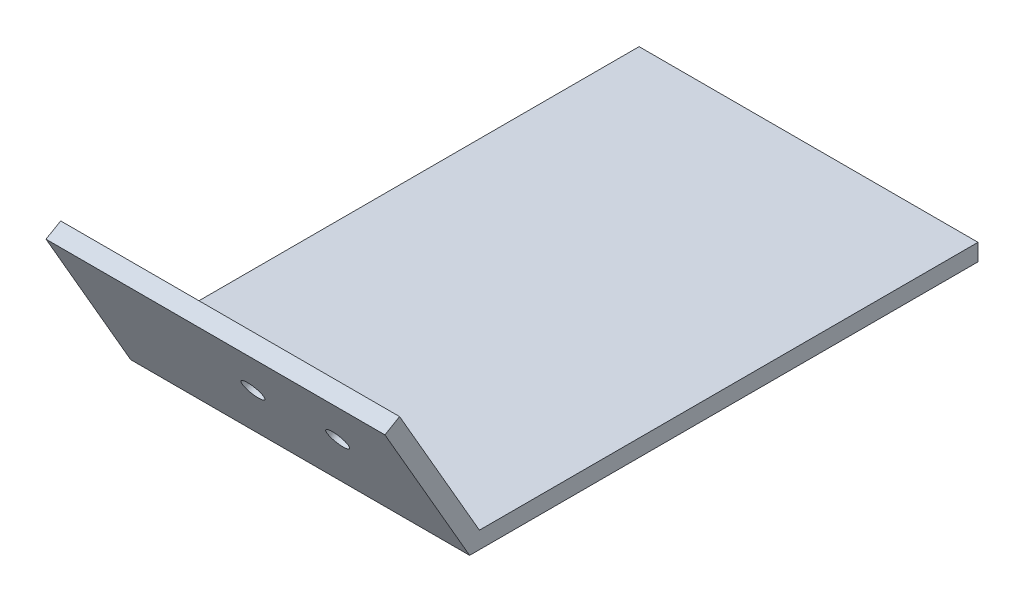
ISO-10303-21;
HEADER;
FILE_DESCRIPTION(('STEP AP214'),'2;1');
FILE_NAME('part.step','',(''),(''),'','','');
FILE_SCHEMA(('AUTOMOTIVE_DESIGN { 1 0 10303 214 1 1 1 1 }'));
ENDSEC;
DATA;
#1=APPLICATION_CONTEXT('core data for automotive mechanical design processes');
#2=APPLICATION_PROTOCOL_DEFINITION('international standard','automotive_design',2000,#1);
#3=PRODUCT_CONTEXT('',#1,'mechanical');
#4=PRODUCT('Part','Part','',(#3));
#5=PRODUCT_RELATED_PRODUCT_CATEGORY('part','',(#4));
#6=PRODUCT_DEFINITION_FORMATION('','',#4);
#7=PRODUCT_DEFINITION_CONTEXT('part definition',#1,'design');
#8=PRODUCT_DEFINITION('design','',#6,#7);
#9=PRODUCT_DEFINITION_SHAPE('','',#8);
#10=(LENGTH_UNIT() NAMED_UNIT(*) SI_UNIT(.MILLI.,.METRE.));
#11=(NAMED_UNIT(*) PLANE_ANGLE_UNIT() SI_UNIT($,.RADIAN.));
#12=(NAMED_UNIT(*) SI_UNIT($,.STERADIAN.) SOLID_ANGLE_UNIT());
#13=UNCERTAINTY_MEASURE_WITH_UNIT(LENGTH_MEASURE(1.E-05),#10,'distance_accuracy_value','');
#14=(GEOMETRIC_REPRESENTATION_CONTEXT(3) GLOBAL_UNCERTAINTY_ASSIGNED_CONTEXT((#13)) GLOBAL_UNIT_ASSIGNED_CONTEXT((#10,
#11,#12)) REPRESENTATION_CONTEXT('',''));
#15=CARTESIAN_POINT('',(0.,0.,0.));
#16=DIRECTION('',(0.,0.,1.));
#17=DIRECTION('',(1.,0.,0.));
#18=AXIS2_PLACEMENT_3D('',#15,#16,#17);
#19=CARTESIAN_POINT('',(100.,0.,-150.));
#20=DIRECTION('',(0.,1.,0.));
#21=DIRECTION('',(0.,0.,1.));
#22=AXIS2_PLACEMENT_3D('',#19,#20,#21);
#23=PLANE('',#22);
#24=DIRECTION('',(0.,0.,-1.));
#25=VECTOR('',#24,1.);
#26=CARTESIAN_POINT('',(0.,0.,-150.));
#27=LINE('',#26,#25);
#28=CARTESIAN_POINT('',(0.,0.,0.));
#29=VERTEX_POINT('',#28);
#30=CARTESIAN_POINT('',(0.,0.,-150.));
#31=VERTEX_POINT('',#30);
#32=EDGE_CURVE('E119',#29,#31,#27,.T.);
#33=ORIENTED_EDGE('',*,*,#32,.T.);
#34=DIRECTION('',(-1.,0.,0.));
#35=VECTOR('',#34,1.);
#36=CARTESIAN_POINT('',(100.,0.,-150.));
#37=LINE('',#36,#35);
#38=CARTESIAN_POINT('',(100.,0.,-150.));
#39=VERTEX_POINT('',#38);
#40=EDGE_CURVE('E11',#39,#31,#37,.T.);
#41=ORIENTED_EDGE('',*,*,#40,.F.);
#42=DIRECTION('',(0.,0.,-1.));
#43=VECTOR('',#42,1.);
#44=CARTESIAN_POINT('',(100.,0.,-150.));
#45=LINE('',#44,#43);
#46=CARTESIAN_POINT('',(100.,0.,0.));
#47=VERTEX_POINT('',#46);
#48=EDGE_CURVE('E130',#47,#39,#45,.T.);
#49=ORIENTED_EDGE('',*,*,#48,.F.);
#50=DIRECTION('',(-1.,0.,0.));
#51=VECTOR('',#50,1.);
#52=CARTESIAN_POINT('',(100.,0.,0.));
#53=LINE('',#52,#51);
#54=EDGE_CURVE('E115',#47,#29,#53,.T.);
#55=ORIENTED_EDGE('',*,*,#54,.T.);
#56=EDGE_LOOP('',(#33,#41,#49,#55));
#57=FACE_BOUND('',#56,.T.);
#58=ADVANCED_FACE('F33',(#57),#23,.F.);
#59=CARTESIAN_POINT('',(100.,5.00000000000001,-150.));
#60=DIRECTION('',(0.,0.,1.));
#61=DIRECTION('',(1.,0.,0.));
#62=AXIS2_PLACEMENT_3D('',#59,#60,#61);
#63=PLANE('',#62);
#64=DIRECTION('',(0.,1.,0.));
#65=VECTOR('',#64,1.);
#66=CARTESIAN_POINT('',(0.,5.00000000000001,-150.));
#67=LINE('',#66,#65);
#68=CARTESIAN_POINT('',(0.,5.00000000000001,-150.));
#69=VERTEX_POINT('',#68);
#70=EDGE_CURVE('E122',#31,#69,#67,.T.);
#71=ORIENTED_EDGE('',*,*,#70,.T.);
#72=DIRECTION('',(-1.,0.,0.));
#73=VECTOR('',#72,1.);
#74=CARTESIAN_POINT('',(100.,5.00000000000001,-150.));
#75=LINE('',#74,#73);
#76=CARTESIAN_POINT('',(100.,5.00000000000001,-150.));
#77=VERTEX_POINT('',#76);
#78=EDGE_CURVE('E42',#77,#69,#75,.T.);
#79=ORIENTED_EDGE('',*,*,#78,.F.);
#80=DIRECTION('',(0.,1.,0.));
#81=VECTOR('',#80,1.);
#82=CARTESIAN_POINT('',(100.,5.00000000000001,-150.));
#83=LINE('',#82,#81);
#84=EDGE_CURVE('E88',#39,#77,#83,.T.);
#85=ORIENTED_EDGE('',*,*,#84,.F.);
#86=ORIENTED_EDGE('',*,*,#40,.T.);
#87=EDGE_LOOP('',(#71,#79,#85,#86));
#88=FACE_BOUND('',#87,.T.);
#89=ADVANCED_FACE('F150',(#88),#63,.F.);
#90=CARTESIAN_POINT('',(100.,5.,-2.88675134594811));
#91=DIRECTION('',(0.,-1.,0.));
#92=DIRECTION('',(0.,0.,-1.));
#93=AXIS2_PLACEMENT_3D('',#90,#91,#92);
#94=PLANE('',#93);
#95=DIRECTION('',(0.,0.,1.));
#96=VECTOR('',#95,1.);
#97=CARTESIAN_POINT('',(0.,5.,-2.88675134594811));
#98=LINE('',#97,#96);
#99=CARTESIAN_POINT('',(0.,5.,-2.88675134594811));
#100=VERTEX_POINT('',#99);
#101=EDGE_CURVE('E125',#69,#100,#98,.T.);
#102=ORIENTED_EDGE('',*,*,#101,.T.);
#103=DIRECTION('',(-1.,0.,0.));
#104=VECTOR('',#103,1.);
#105=CARTESIAN_POINT('',(100.,5.,-2.88675134594811));
#106=LINE('',#105,#104);
#107=CARTESIAN_POINT('',(100.,5.,-2.88675134594811));
#108=VERTEX_POINT('',#107);
#109=EDGE_CURVE('E110',#108,#100,#106,.T.);
#110=ORIENTED_EDGE('',*,*,#109,.F.);
#111=DIRECTION('',(0.,0.,1.));
#112=VECTOR('',#111,1.);
#113=CARTESIAN_POINT('',(100.,5.,-2.88675134594811));
#114=LINE('',#113,#112);
#115=EDGE_CURVE('E101',#77,#108,#114,.T.);
#116=ORIENTED_EDGE('',*,*,#115,.F.);
#117=ORIENTED_EDGE('',*,*,#78,.T.);
#118=EDGE_LOOP('',(#102,#110,#116,#117));
#119=FACE_BOUND('',#118,.T.);
#120=ADVANCED_FACE('F153',(#119),#94,.F.);
#121=CARTESIAN_POINT('',(100.,45.801270189222,20.6698729810777));
#122=DIRECTION('',(0.,-0.499999999999998,0.86602540378444));
#123=DIRECTION('',(0.,-0.86602540378444,-0.499999999999998));
#124=AXIS2_PLACEMENT_3D('',#121,#122,#123);
#125=PLANE('',#124);
#126=CARTESIAN_POINT('',(50.,26.650635094611,9.61324865405186));
#127=DIRECTION('',(0.,0.499999999999998,-0.86602540378444));
#128=DIRECTION('',(0.,0.86602540378444,0.499999999999998));
#129=AXIS2_PLACEMENT_3D('',#126,#127,#128);
#130=CIRCLE('',#129,3.175);
#131=CARTESIAN_POINT('',(50.,29.4002657516266,11.2007486540519));
#132=VERTEX_POINT('',#131);
#133=EDGE_CURVE('E144',#132,#132,#130,.T.);
#134=ORIENTED_EDGE('',*,*,#133,.F.);
#135=EDGE_LOOP('',(#134));
#136=FACE_BOUND('',#135,.T.);
#137=CARTESIAN_POINT('',(75.,26.650635094611,9.61324865405186));
#138=DIRECTION('',(0.,0.499999999999998,-0.86602540378444));
#139=DIRECTION('',(0.,0.86602540378444,0.499999999999998));
#140=AXIS2_PLACEMENT_3D('',#137,#138,#139);
#141=CIRCLE('',#140,3.175);
#142=CARTESIAN_POINT('',(75.,29.4002657516266,11.2007486540519));
#143=VERTEX_POINT('',#142);
#144=EDGE_CURVE('E136',#143,#143,#141,.T.);
#145=ORIENTED_EDGE('',*,*,#144,.F.);
#146=EDGE_LOOP('',(#145));
#147=FACE_BOUND('',#146,.T.);
#148=DIRECTION('',(0.,0.86602540378444,0.499999999999998));
#149=VECTOR('',#148,1.);
#150=CARTESIAN_POINT('',(0.,45.801270189222,20.6698729810777));
#151=LINE('',#150,#149);
#152=CARTESIAN_POINT('',(0.,45.801270189222,20.6698729810777));
#153=VERTEX_POINT('',#152);
#154=EDGE_CURVE('E109',#100,#153,#151,.T.);
#155=ORIENTED_EDGE('',*,*,#154,.T.);
#156=DIRECTION('',(-1.,0.,0.));
#157=VECTOR('',#156,1.);
#158=CARTESIAN_POINT('',(100.,45.801270189222,20.6698729810777));
#159=LINE('',#158,#157);
#160=CARTESIAN_POINT('',(100.,45.801270189222,20.6698729810777));
#161=VERTEX_POINT('',#160);
#162=EDGE_CURVE('E106',#161,#153,#159,.T.);
#163=ORIENTED_EDGE('',*,*,#162,.F.);
#164=DIRECTION('',(0.,0.86602540378444,0.499999999999998));
#165=VECTOR('',#164,1.);
#166=CARTESIAN_POINT('',(100.,45.801270189222,20.6698729810777));
#167=LINE('',#166,#165);
#168=EDGE_CURVE('E95',#108,#161,#167,.T.);
#169=ORIENTED_EDGE('',*,*,#168,.F.);
#170=ORIENTED_EDGE('',*,*,#109,.T.);
#171=EDGE_LOOP('',(#155,#163,#169,#170));
#172=FACE_BOUND('',#171,.T.);
#173=ADVANCED_FACE('F107',(#136,#147,#172),#125,.F.);
#174=CARTESIAN_POINT('',(100.,43.301270189222,24.9999999999999));
#175=DIRECTION('',(0.,-0.866025403784441,-0.499999999999996));
#176=DIRECTION('',(0.,0.499999999999996,-0.866025403784441));
#177=AXIS2_PLACEMENT_3D('',#174,#175,#176);
#178=PLANE('',#177);
#179=DIRECTION('',(0.,-0.499999999999996,0.866025403784441));
#180=VECTOR('',#179,1.);
#181=CARTESIAN_POINT('',(0.,43.301270189222,24.9999999999999));
#182=LINE('',#181,#180);
#183=CARTESIAN_POINT('',(0.,43.301270189222,24.9999999999999));
#184=VERTEX_POINT('',#183);
#185=EDGE_CURVE('E74',#153,#184,#182,.T.);
#186=ORIENTED_EDGE('',*,*,#185,.T.);
#187=DIRECTION('',(-1.,0.,0.));
#188=VECTOR('',#187,1.);
#189=CARTESIAN_POINT('',(100.,43.301270189222,24.9999999999999));
#190=LINE('',#189,#188);
#191=CARTESIAN_POINT('',(100.,43.301270189222,24.9999999999999));
#192=VERTEX_POINT('',#191);
#193=EDGE_CURVE('E111',#192,#184,#190,.T.);
#194=ORIENTED_EDGE('',*,*,#193,.F.);
#195=DIRECTION('',(0.,-0.499999999999996,0.866025403784441));
#196=VECTOR('',#195,1.);
#197=CARTESIAN_POINT('',(100.,43.301270189222,24.9999999999999));
#198=LINE('',#197,#196);
#199=EDGE_CURVE('E99',#161,#192,#198,.T.);
#200=ORIENTED_EDGE('',*,*,#199,.F.);
#201=ORIENTED_EDGE('',*,*,#162,.T.);
#202=EDGE_LOOP('',(#186,#194,#200,#201));
#203=FACE_BOUND('',#202,.T.);
#204=ADVANCED_FACE('F113',(#203),#178,.F.);
#205=CARTESIAN_POINT('',(100.,0.,0.));
#206=DIRECTION('',(0.,0.499999999999998,-0.86602540378444));
#207=DIRECTION('',(0.,0.86602540378444,0.499999999999998));
#208=AXIS2_PLACEMENT_3D('',#205,#206,#207);
#209=PLANE('',#208);
#210=CARTESIAN_POINT('',(50.,24.150635094611,13.943375672974));
#211=DIRECTION('',(0.,0.499999999999998,-0.86602540378444));
#212=DIRECTION('',(0.,0.86602540378444,0.499999999999998));
#213=AXIS2_PLACEMENT_3D('',#210,#211,#212);
#214=CIRCLE('',#213,3.175);
#215=CARTESIAN_POINT('',(50.,26.9002657516266,15.530875672974));
#216=VERTEX_POINT('',#215);
#217=EDGE_CURVE('E36',#216,#216,#214,.T.);
#218=ORIENTED_EDGE('',*,*,#217,.T.);
#219=EDGE_LOOP('',(#218));
#220=FACE_BOUND('',#219,.T.);
#221=CARTESIAN_POINT('',(75.,24.150635094611,13.943375672974));
#222=DIRECTION('',(0.,0.499999999999998,-0.86602540378444));
#223=DIRECTION('',(0.,0.86602540378444,0.499999999999998));
#224=AXIS2_PLACEMENT_3D('',#221,#222,#223);
#225=CIRCLE('',#224,3.175);
#226=CARTESIAN_POINT('',(75.,26.9002657516266,15.530875672974));
#227=VERTEX_POINT('',#226);
#228=EDGE_CURVE('E123',#227,#227,#225,.T.);
#229=ORIENTED_EDGE('',*,*,#228,.T.);
#230=EDGE_LOOP('',(#229));
#231=FACE_BOUND('',#230,.T.);
#232=DIRECTION('',(0.,-0.86602540378444,-0.499999999999998));
#233=VECTOR('',#232,1.);
#234=CARTESIAN_POINT('',(0.,0.,0.));
#235=LINE('',#234,#233);
#236=EDGE_CURVE('E80',#184,#29,#235,.T.);
#237=ORIENTED_EDGE('',*,*,#236,.T.);
#238=ORIENTED_EDGE('',*,*,#54,.F.);
#239=DIRECTION('',(0.,-0.86602540378444,-0.499999999999998));
#240=VECTOR('',#239,1.);
#241=CARTESIAN_POINT('',(100.,0.,0.));
#242=LINE('',#241,#240);
#243=EDGE_CURVE('E51',#192,#47,#242,.T.);
#244=ORIENTED_EDGE('',*,*,#243,.F.);
#245=ORIENTED_EDGE('',*,*,#193,.T.);
#246=EDGE_LOOP('',(#237,#238,#244,#245));
#247=FACE_BOUND('',#246,.T.);
#248=ADVANCED_FACE('F158',(#220,#231,#247),#209,.F.);
#249=CARTESIAN_POINT('',(100.,0.,-150.));
#250=DIRECTION('',(1.,0.,0.));
#251=DIRECTION('',(0.,0.,-1.));
#252=AXIS2_PLACEMENT_3D('',#249,#250,#251);
#253=PLANE('',#252);
#254=ORIENTED_EDGE('',*,*,#48,.T.);
#255=ORIENTED_EDGE('',*,*,#84,.T.);
#256=ORIENTED_EDGE('',*,*,#115,.T.);
#257=ORIENTED_EDGE('',*,*,#168,.T.);
#258=ORIENTED_EDGE('',*,*,#199,.T.);
#259=ORIENTED_EDGE('',*,*,#243,.T.);
#260=EDGE_LOOP('',(#254,#255,#256,#257,#258,#259));
#261=FACE_BOUND('',#260,.T.);
#262=ADVANCED_FACE('F97',(#261),#253,.T.);
#263=CARTESIAN_POINT('',(0.,0.,-150.));
#264=DIRECTION('',(1.,0.,0.));
#265=DIRECTION('',(0.,0.,-1.));
#266=AXIS2_PLACEMENT_3D('',#263,#264,#265);
#267=PLANE('',#266);
#268=ORIENTED_EDGE('',*,*,#32,.F.);
#269=ORIENTED_EDGE('',*,*,#236,.F.);
#270=ORIENTED_EDGE('',*,*,#185,.F.);
#271=ORIENTED_EDGE('',*,*,#154,.F.);
#272=ORIENTED_EDGE('',*,*,#101,.F.);
#273=ORIENTED_EDGE('',*,*,#70,.F.);
#274=EDGE_LOOP('',(#268,#269,#270,#271,#272,#273));
#275=FACE_BOUND('',#274,.T.);
#276=ADVANCED_FACE('F156',(#275),#267,.F.);
#277=CARTESIAN_POINT('',(75.,13.3253175473056,32.693375672974));
#278=DIRECTION('',(0.,0.499999999999998,-0.86602540378444));
#279=DIRECTION('',(0.,0.86602540378444,0.499999999999998));
#280=AXIS2_PLACEMENT_3D('',#277,#278,#279);
#281=CYLINDRICAL_SURFACE('',#280,3.175);
#282=ORIENTED_EDGE('',*,*,#144,.T.);
#283=EDGE_LOOP('',(#282));
#284=FACE_BOUND('',#283,.T.);
#285=ORIENTED_EDGE('',*,*,#228,.F.);
#286=EDGE_LOOP('',(#285));
#287=FACE_BOUND('',#286,.T.);
#288=ADVANCED_FACE('F189',(#284,#287),#281,.F.);
#289=CARTESIAN_POINT('',(50.,13.3253175473056,32.693375672974));
#290=DIRECTION('',(0.,0.499999999999998,-0.86602540378444));
#291=DIRECTION('',(0.,0.86602540378444,0.499999999999998));
#292=AXIS2_PLACEMENT_3D('',#289,#290,#291);
#293=CYLINDRICAL_SURFACE('',#292,3.175);
#294=ORIENTED_EDGE('',*,*,#133,.T.);
#295=EDGE_LOOP('',(#294));
#296=FACE_BOUND('',#295,.T.);
#297=ORIENTED_EDGE('',*,*,#217,.F.);
#298=EDGE_LOOP('',(#297));
#299=FACE_BOUND('',#298,.T.);
#300=ADVANCED_FACE('F186',(#296,#299),#293,.F.);
#301=CLOSED_SHELL('',(#58,#89,#120,#173,#204,#248,#262,#276,#288,#300));
#302=MANIFOLD_SOLID_BREP('B2',#301);
#303=ADVANCED_BREP_SHAPE_REPRESENTATION('',(#18,#302),#14);
#304=SHAPE_DEFINITION_REPRESENTATION(#9,#303);
ENDSEC;
END-ISO-10303-21;
